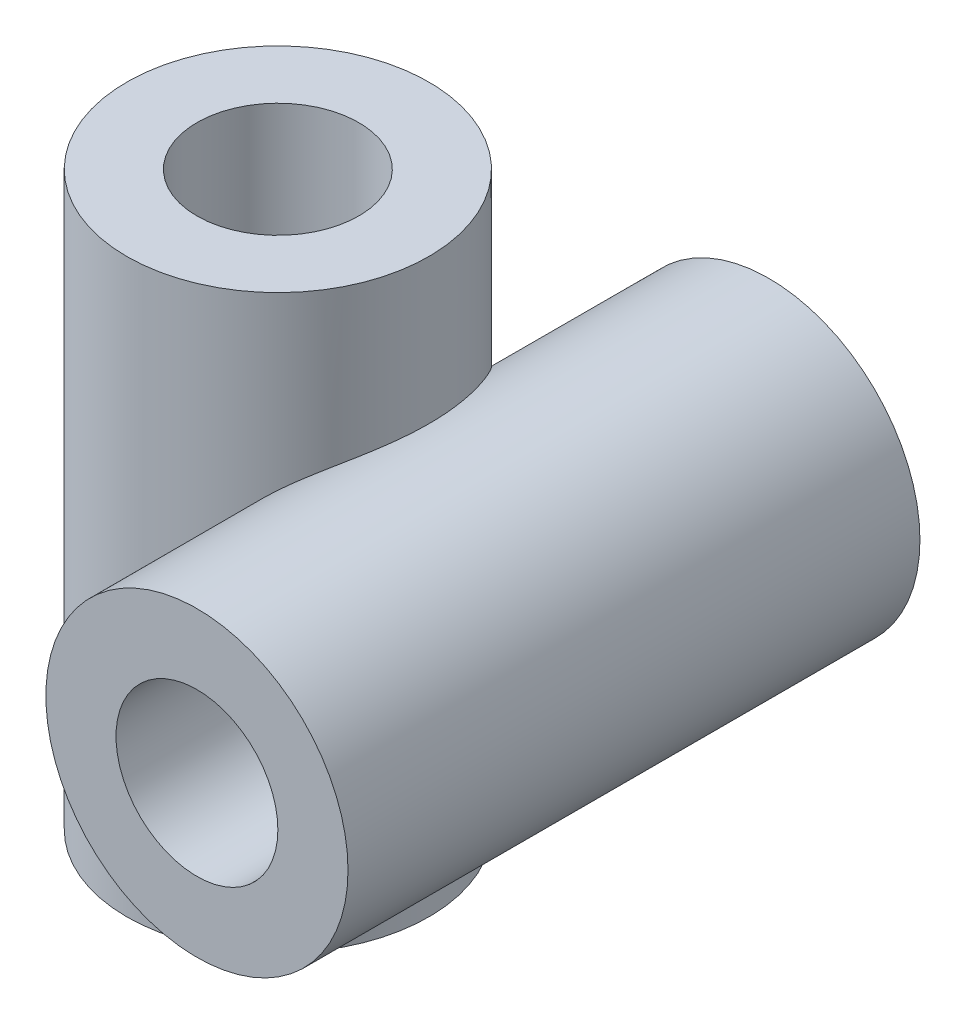
ISO-10303-21;
HEADER;
FILE_DESCRIPTION(('STEP AP214'),'2;1');
FILE_NAME('part.step','',(''),(''),'','','');
FILE_SCHEMA(('AUTOMOTIVE_DESIGN { 1 0 10303 214 1 1 1 1 }'));
ENDSEC;
DATA;
#1=APPLICATION_CONTEXT('core data for automotive mechanical design processes');
#2=APPLICATION_PROTOCOL_DEFINITION('international standard','automotive_design',2000,#1);
#3=PRODUCT_CONTEXT('',#1,'mechanical');
#4=PRODUCT('Part','Part','',(#3));
#5=PRODUCT_RELATED_PRODUCT_CATEGORY('part','',(#4));
#6=PRODUCT_DEFINITION_FORMATION('','',#4);
#7=PRODUCT_DEFINITION_CONTEXT('part definition',#1,'design');
#8=PRODUCT_DEFINITION('design','',#6,#7);
#9=PRODUCT_DEFINITION_SHAPE('','',#8);
#10=(LENGTH_UNIT() NAMED_UNIT(*) SI_UNIT(.MILLI.,.METRE.));
#11=(NAMED_UNIT(*) PLANE_ANGLE_UNIT() SI_UNIT($,.RADIAN.));
#12=(NAMED_UNIT(*) SI_UNIT($,.STERADIAN.) SOLID_ANGLE_UNIT());
#13=UNCERTAINTY_MEASURE_WITH_UNIT(LENGTH_MEASURE(1.E-05),#10,'distance_accuracy_value','');
#14=(GEOMETRIC_REPRESENTATION_CONTEXT(3) GLOBAL_UNCERTAINTY_ASSIGNED_CONTEXT((#13)) GLOBAL_UNIT_ASSIGNED_CONTEXT((#10,
#11,#12)) REPRESENTATION_CONTEXT('',''));
#15=CARTESIAN_POINT('',(0.,0.,0.));
#16=DIRECTION('',(0.,0.,1.));
#17=DIRECTION('',(1.,0.,0.));
#18=AXIS2_PLACEMENT_3D('',#15,#16,#17);
#19=CARTESIAN_POINT('',(0.,0.,106.));
#20=DIRECTION('',(0.,0.,-1.));
#21=DIRECTION('',(-1.,0.,0.));
#22=AXIS2_PLACEMENT_3D('',#19,#20,#21);
#23=CYLINDRICAL_SURFACE('',#22,28.);
#24=CARTESIAN_POINT('',(0.,0.,0.));
#25=DIRECTION('',(0.,0.,1.));
#26=DIRECTION('',(1.,0.,0.));
#27=AXIS2_PLACEMENT_3D('',#24,#25,#26);
#28=CIRCLE('',#27,28.);
#29=CARTESIAN_POINT('',(28.,0.,0.));
#30=VERTEX_POINT('',#29);
#31=EDGE_CURVE('E43',#30,#30,#28,.T.);
#32=ORIENTED_EDGE('',*,*,#31,.T.);
#33=EDGE_LOOP('',(#32));
#34=FACE_BOUND('',#33,.T.);
#35=CARTESIAN_POINT('',(0.,0.,106.));
#36=DIRECTION('',(0.,0.,1.));
#37=DIRECTION('',(1.,0.,0.));
#38=AXIS2_PLACEMENT_3D('',#35,#36,#37);
#39=CIRCLE('',#38,28.);
#40=CARTESIAN_POINT('',(28.,0.,106.));
#41=VERTEX_POINT('',#40);
#42=EDGE_CURVE('E48',#41,#41,#39,.T.);
#43=ORIENTED_EDGE('',*,*,#42,.F.);
#44=EDGE_LOOP('',(#43));
#45=FACE_BOUND('',#44,.T.);
#46=CARTESIAN_POINT('',(-28.,0.,79.1533936612441));
#47=CARTESIAN_POINT('',(-27.9999984381259,0.709976885836484,79.1533951565687));
#48=CARTESIAN_POINT('',(-27.9729742140714,1.41998183568938,79.143108613888));
#49=CARTESIAN_POINT('',(-27.8651177596588,2.83530719546801,79.1014840703157));
#50=CARTESIAN_POINT('',(-27.7842822941506,3.54062732116545,79.0701448037262));
#51=CARTESIAN_POINT('',(-27.5695302381335,4.94202781984829,78.9849696736577));
#52=CARTESIAN_POINT('',(-27.4355958153276,5.63810500751963,78.9311262522472));
#53=CARTESIAN_POINT('',(-27.1159995271492,7.01588430780221,78.7986131405806));
#54=CARTESIAN_POINT('',(-26.930338507867,7.69758665534608,78.7199438563977));
#55=CARTESIAN_POINT('',(-26.5087446696491,9.04351225614709,78.534373351261));
#56=CARTESIAN_POINT('',(-26.2726712965789,9.70768068275535,78.4273929927594));
#57=CARTESIAN_POINT('',(-25.7535046874517,11.0113205595334,78.1814576369852));
#58=CARTESIAN_POINT('',(-25.4704109052659,11.6507917227451,78.0425022683247));
#59=CARTESIAN_POINT('',(-24.861405165573,12.8993262251224,77.7284162876105));
#60=CARTESIAN_POINT('',(-24.5355187352839,13.5084073963288,77.5533072070682));
#61=CARTESIAN_POINT('',(-23.8460975935534,14.6912238323088,77.1624488017474));
#62=CARTESIAN_POINT('',(-23.4825657553982,15.2649617893303,76.9467025775715));
#63=CARTESIAN_POINT('',(-22.7436764670392,16.344145503955,76.4824431934799));
#64=CARTESIAN_POINT('',(-22.3698372914414,16.8515755503644,76.2361282063485));
#65=CARTESIAN_POINT('',(-21.6012246731877,17.8261652888708,75.7002095711564));
#66=CARTESIAN_POINT('',(-21.2064520259499,18.2933265093112,75.4106075671317));
#67=CARTESIAN_POINT('',(-20.404222973058,19.1840229994171,74.7863869713479));
#68=CARTESIAN_POINT('',(-19.9967752350801,19.6075872638468,74.4517986443978));
#69=CARTESIAN_POINT('',(-19.1776381360441,20.4094758106507,73.7367800183871));
#70=CARTESIAN_POINT('',(-18.7659491030331,20.7878035637734,73.3563532407609));
#71=CARTESIAN_POINT('',(-17.9867462707627,21.4643214609533,72.5892613550195));
#72=CARTESIAN_POINT('',(-17.6187999937689,21.7667211277595,72.2067333764708));
#73=CARTESIAN_POINT('',(-16.8931257119261,22.3346052027225,71.406292178076));
#74=CARTESIAN_POINT('',(-16.5353969830291,22.6000922318087,70.9883814739235));
#75=CARTESIAN_POINT('',(-15.8360011738096,23.095559436879,70.1192402233057));
#76=CARTESIAN_POINT('',(-15.4943378678454,23.3255312977475,69.6680019103407));
#77=CARTESIAN_POINT('',(-14.8324261033276,23.7519302638262,68.735015088988));
#78=CARTESIAN_POINT('',(-14.5121784747898,23.9483560693368,68.2532653994664));
#79=CARTESIAN_POINT('',(-13.8948748078847,24.3117655120013,67.2579434933272));
#80=CARTESIAN_POINT('',(-13.5980518122444,24.478470106555,66.7441251945481));
#81=CARTESIAN_POINT('',(-13.0346403283078,24.7830738132666,65.6920037715129));
#82=CARTESIAN_POINT('',(-12.76805172272,24.9209730371738,65.1537007422543));
#83=CARTESIAN_POINT('',(-12.268096840831,25.1708552897019,64.0559060360338));
#84=CARTESIAN_POINT('',(-12.0347396656878,25.2828312238934,63.4964086074304));
#85=CARTESIAN_POINT('',(-11.6037109566939,25.4835321693592,62.3597780049199));
#86=CARTESIAN_POINT('',(-11.4060414365424,25.5722558687385,61.7826438379954));
#87=CARTESIAN_POINT('',(-11.0305141536826,25.7366260584061,60.5562992471674));
#88=CARTESIAN_POINT('',(-10.856547996343,25.8101120241989,59.9056046774216));
#89=CARTESIAN_POINT('',(-10.5556605435343,25.9346203207608,58.5913158839528));
#90=CARTESIAN_POINT('',(-10.4287418836904,25.9856413930649,57.9277209397351));
#91=CARTESIAN_POINT('',(-10.2230816984669,26.0672373257567,56.5916315771135));
#92=CARTESIAN_POINT('',(-10.1443570678987,26.0978050163927,55.9191341221664));
#93=CARTESIAN_POINT('',(-10.0358328302353,26.1397287660719,54.5696073712688));
#94=CARTESIAN_POINT('',(-10.0060346338571,26.1510842711621,53.8925779452111));
#95=CARTESIAN_POINT('',(-9.99524600557182,26.1552134988389,52.4892588680764));
#96=CARTESIAN_POINT('',(-10.0179258847931,26.1465898271697,51.7629337264117));
#97=CARTESIAN_POINT('',(-10.1196018400561,26.1074050165719,50.3147976300103));
#98=CARTESIAN_POINT('',(-10.1986009618216,26.0768426912085,49.592986921542));
#99=CARTESIAN_POINT('',(-10.4121705774214,25.9923045704661,48.1587786889989));
#100=CARTESIAN_POINT('',(-10.5467578204893,25.9383217180105,47.4463840689053));
#101=CARTESIAN_POINT('',(-10.870088334781,25.8044913168915,46.0364550563472));
#102=CARTESIAN_POINT('',(-11.0588307801031,25.7246441626729,45.3389204374324));
#103=CARTESIAN_POINT('',(-11.4890794544685,25.5353962646344,43.9615554347488));
#104=CARTESIAN_POINT('',(-11.7307753266249,25.4258889565018,43.2817987735599));
#105=CARTESIAN_POINT('',(-12.2633789074592,25.1733260828958,41.9482227437783));
#106=CARTESIAN_POINT('',(-12.5542874524101,25.0302699473098,41.2944038161796));
#107=CARTESIAN_POINT('',(-13.1807464966522,24.7061154040043,40.0188955486616));
#108=CARTESIAN_POINT('',(-13.5162646186848,24.5250445323886,39.3971833560734));
#109=CARTESIAN_POINT('',(-14.2263503840095,24.1200714915482,38.1911149479392));
#110=CARTESIAN_POINT('',(-14.6009139018382,23.8961738452374,37.6067547963499));
#111=CARTESIAN_POINT('',(-15.3533418950786,23.4191905727623,36.5217547384183));
#112=CARTESIAN_POINT('',(-15.7289826071127,23.1694146657741,36.018116974594));
#113=CARTESIAN_POINT('',(-16.5005041850347,22.6264386530195,35.0513494832961));
#114=CARTESIAN_POINT('',(-16.8963839382018,22.3332409328603,34.5882175326429));
#115=CARTESIAN_POINT('',(-17.7000722646121,21.7018044114343,33.7057277665815));
#116=CARTESIAN_POINT('',(-18.1078724327715,21.3635967760817,33.286340016896));
#117=CARTESIAN_POINT('',(-18.9269531056332,20.6414231320502,32.4928298168692));
#118=CARTESIAN_POINT('',(-19.3382333596299,20.2574603939361,32.1187041350529));
#119=CARTESIAN_POINT('',(-20.1158073335202,19.483975929758,31.450227859341));
#120=CARTESIAN_POINT('',(-20.482602941555,19.0985878612223,31.1516608938746));
#121=CARTESIAN_POINT('',(-21.205433893717,18.2926889936425,30.5912584996875));
#122=CARTESIAN_POINT('',(-21.5614700162967,17.8721807438804,30.3294204086047));
#123=CARTESIAN_POINT('',(-22.2570193148065,16.9981503811355,29.8409999388902));
#124=CARTESIAN_POINT('',(-22.5965283814272,16.5446201267706,29.6144262979983));
#125=CARTESIAN_POINT('',(-23.2537517569303,15.6073908715784,29.1945322607718));
#126=CARTESIAN_POINT('',(-23.5714651818277,15.1236906486383,29.0012132126941));
#127=CARTESIAN_POINT('',(-24.1842733360341,14.1233517127056,28.6432109737138));
#128=CARTESIAN_POINT('',(-24.4790549676851,13.606390279199,28.4788947620416));
#129=CARTESIAN_POINT('',(-25.0379816586756,12.5482093878485,28.1789057433235));
#130=CARTESIAN_POINT('',(-25.3021267825501,12.0069899811069,28.0432328759406));
#131=CARTESIAN_POINT('',(-25.796841411303,10.9036069024846,27.7976342067729));
#132=CARTESIAN_POINT('',(-26.0274017404512,10.3414375593412,27.6877154363142));
#133=CARTESIAN_POINT('',(-26.4525292918458,9.19972000244511,27.4909666374779));
#134=CARTESIAN_POINT('',(-26.6470944932686,8.62017081508169,27.4041379052919));
#135=CARTESIAN_POINT('',(-27.0159263150997,7.38869839317002,27.2435520933483));
#136=CARTESIAN_POINT('',(-27.1862497079339,6.73530964000983,27.1719538675638));
#137=CARTESIAN_POINT('',(-27.4795241963479,5.41595216513477,27.0511130743347));
#138=CARTESIAN_POINT('',(-27.602472611288,4.74998273379767,27.0018717718939));
#139=CARTESIAN_POINT('',(-27.7999023836183,3.40948079075566,26.9237790308362));
#140=CARTESIAN_POINT('',(-27.8743666610372,2.73494534664035,26.8949347773754));
#141=CARTESIAN_POINT('',(-27.9741177542991,1.3817023809471,26.8564631395068));
#142=CARTESIAN_POINT('',(-27.9994031924385,0.702994743022993,26.8468362934581));
#143=CARTESIAN_POINT('',(-28.0006172251421,-0.702444851428929,26.8463684529381));
#144=CARTESIAN_POINT('',(-27.9729341781602,-1.42918348305218,26.8569021102174));
#145=CARTESIAN_POINT('',(-27.86120268258,-2.87769021143441,26.9000317101688));
#146=CARTESIAN_POINT('',(-27.7771512150413,-3.59945803987881,26.9326288345014));
#147=CARTESIAN_POINT('',(-27.5534821826111,-5.03309707628124,27.0214560111069));
#148=CARTESIAN_POINT('',(-27.4138483643097,-5.74496532632873,27.0776929764199));
#149=CARTESIAN_POINT('',(-27.0804977191668,-7.15333862947437,27.2163417040296));
#150=CARTESIAN_POINT('',(-26.8867817907477,-7.8498439375773,27.2987530315159));
#151=CARTESIAN_POINT('',(-26.447073366051,-9.22352409660855,27.4933776701365));
#152=CARTESIAN_POINT('',(-26.2009743118044,-9.90065630463831,27.6056518463836));
#153=CARTESIAN_POINT('',(-25.6599765712134,-11.2285124794813,27.8640967418021));
#154=CARTESIAN_POINT('',(-25.3650771202214,-11.8792360323015,28.0102679921171));
#155=CARTESIAN_POINT('',(-24.7311670990912,-13.1480753592906,28.3410116150776));
#156=CARTESIAN_POINT('',(-24.3921897330951,-13.7662151912565,28.5255551437353));
#157=CARTESIAN_POINT('',(-23.675828041825,-14.9647031238778,28.9378157071812));
#158=CARTESIAN_POINT('',(-23.2984478499594,-15.5450552807281,29.1655280978504));
#159=CARTESIAN_POINT('',(-22.5419830103742,-16.6210364876805,29.649711508497));
#160=CARTESIAN_POINT('',(-22.1651158857606,-17.1197564281276,29.9027804933281));
#161=CARTESIAN_POINT('',(-21.3919444052643,-18.0765856945976,30.4523330118952));
#162=CARTESIAN_POINT('',(-20.9956411418849,-18.5346972991561,30.7488141072974));
#163=CARTESIAN_POINT('',(-20.1919117618148,-19.4071725263124,31.386695385958));
#164=CARTESIAN_POINT('',(-19.7844931646755,-19.8215648446528,31.7280657707567));
#165=CARTESIAN_POINT('',(-18.9669617898868,-20.6052176020023,32.4563164276062));
#166=CARTESIAN_POINT('',(-18.5568491981139,-20.9744811209861,32.8431935903451));
#167=CARTESIAN_POINT('',(-17.7817117745733,-21.6343390541934,33.6223495565918));
#168=CARTESIAN_POINT('',(-17.4161259015717,-21.929079688092,34.0105733391136));
#169=CARTESIAN_POINT('',(-16.6962490036892,-22.4820211578104,34.8218754375706));
#170=CARTESIAN_POINT('',(-16.3419571686232,-22.7402246192381,35.2449512455342));
#171=CARTESIAN_POINT('',(-15.6503525845425,-23.2216303989772,36.1238027594317));
#172=CARTESIAN_POINT('',(-15.3130441393395,-23.4448238753149,36.5795866837635));
#173=CARTESIAN_POINT('',(-14.6605929868522,-23.8582529534624,37.5209788288913));
#174=CARTESIAN_POINT('',(-14.3454512074691,-24.0484871760782,38.0065882965988));
#175=CARTESIAN_POINT('',(-13.737196875416,-24.4011248483334,39.0119096579434));
#176=CARTESIAN_POINT('',(-13.4444814171042,-24.5630725646571,39.5320211758612));
#177=CARTESIAN_POINT('',(-12.8900883811088,-24.8584858239743,40.5962753071398));
#178=CARTESIAN_POINT('',(-12.6284107982749,-24.9919513716939,41.1404179165131));
#179=CARTESIAN_POINT('',(-12.1389837782726,-25.2333028926104,42.2494042521677));
#180=CARTESIAN_POINT('',(-11.9112436719903,-25.3411818357441,42.8142536186425));
#181=CARTESIAN_POINT('',(-11.492064624323,-25.5340101618256,43.9610741647369));
#182=CARTESIAN_POINT('',(-11.3006277085367,-25.6189582654199,44.543046297659));
#183=CARTESIAN_POINT('',(-10.9385588964511,-25.7757783418845,45.7796231995516));
#184=CARTESIAN_POINT('',(-10.7719193309279,-25.8454945131698,46.435673391265));
#185=CARTESIAN_POINT('',(-10.486336099191,-25.9626764261116,47.7600307187985));
#186=CARTESIAN_POINT('',(-10.3673951574701,-26.0101408968017,48.4283385524823));
#187=CARTESIAN_POINT('',(-10.178266495883,-26.0847320503578,49.7731770679717));
#188=CARTESIAN_POINT('',(-10.1080960100257,-26.1118515441907,50.4497105706417));
#189=CARTESIAN_POINT('',(-10.0171808435069,-26.1468628637206,51.8065862749177));
#190=CARTESIAN_POINT('',(-9.99643750668897,-26.1547541666347,52.4869285795749));
#191=CARTESIAN_POINT('',(-10.0048410040642,-26.1515444077961,53.8943801637785));
#192=CARTESIAN_POINT('',(-10.0375391411801,-26.1390914492149,54.621468189172));
#193=CARTESIAN_POINT('',(-10.1593417088307,-26.091991288264,56.0702152119083));
#194=CARTESIAN_POINT('',(-10.2484491303045,-26.0573429090451,56.791873919324));
#195=CARTESIAN_POINT('',(-10.4822154525706,-25.9641867296754,58.2248085396395));
#196=CARTESIAN_POINT('',(-10.626890063598,-25.9056721816715,58.9360814571303));
#197=CARTESIAN_POINT('',(-10.9702387489759,-25.7621517231294,60.3427591009378));
#198=CARTESIAN_POINT('',(-11.1689118510374,-25.6771462895783,61.0381641127252));
#199=CARTESIAN_POINT('',(-11.6180183572904,-25.477089230705,62.4080160822885));
#200=CARTESIAN_POINT('',(-11.8684755699675,-25.3620237784241,63.0824532351325));
#201=CARTESIAN_POINT('',(-12.4177648438296,-25.0976485013044,64.4044513688151));
#202=CARTESIAN_POINT('',(-12.7165975974723,-24.9483381862648,65.0520119647704));
#203=CARTESIAN_POINT('',(-13.3578306286778,-24.6109615755607,66.3140536238503));
#204=CARTESIAN_POINT('',(-13.7001970001655,-24.4229253715985,66.9285599068121));
#205=CARTESIAN_POINT('',(-14.4226813743613,-24.0033455163941,68.1193526670986));
#206=CARTESIAN_POINT('',(-14.8027952425807,-23.7718066275344,68.6956433186803));
#207=CARTESIAN_POINT('',(-15.5631286936547,-23.2804192856283,69.7625414621265));
#208=CARTESIAN_POINT('',(-15.941140942027,-23.0240638551025,70.2563320925975));
#209=CARTESIAN_POINT('',(-16.7157999653771,-22.4679597386105,71.2032114537074));
#210=CARTESIAN_POINT('',(-17.1124456711737,-22.1682135403421,71.6563025153394));
#211=CARTESIAN_POINT('',(-17.9160562978864,-21.5239373570138,72.518772456896));
#212=CARTESIAN_POINT('',(-18.323014482139,-21.1794360307723,72.9281790071026));
#213=CARTESIAN_POINT('',(-19.1388473927572,-20.4451829463782,73.7020057074176));
#214=CARTESIAN_POINT('',(-19.5477219923893,-20.0554341410529,74.0664287899252));
#215=CARTESIAN_POINT('',(-20.3203271558074,-19.2706591431489,74.7177340907624));
#216=CARTESIAN_POINT('',(-20.6846748803314,-18.8796063142696,75.0086888812245));
#217=CARTESIAN_POINT('',(-21.4015479470594,-18.0629145544727,75.5542522011156));
#218=CARTESIAN_POINT('',(-21.7540741246747,-17.637278074838,75.808863303058));
#219=CARTESIAN_POINT('',(-22.4417062473455,-16.7536073069708,76.2833444323065));
#220=CARTESIAN_POINT('',(-22.7768072731573,-16.2955639552752,76.5032046845476));
#221=CARTESIAN_POINT('',(-23.4244768484679,-15.3499941140137,76.9102589311853));
#222=CARTESIAN_POINT('',(-23.7370444609365,-14.8624663999175,77.0974515675904));
#223=CARTESIAN_POINT('',(-24.3407320889631,-13.8521206807165,77.4447926923447));
#224=CARTESIAN_POINT('',(-24.631368618893,-13.3288275032332,77.6043977078006));
#225=CARTESIAN_POINT('',(-25.1812018534866,-12.2584314928989,77.8952844604044));
#226=CARTESIAN_POINT('',(-25.4403983064527,-11.711328469483,78.0265659708115));
#227=CARTESIAN_POINT('',(-25.9244843759832,-10.5967155290843,78.2637014252133));
#228=CARTESIAN_POINT('',(-26.1493676523434,-10.0292018646139,78.3695506720426));
#229=CARTESIAN_POINT('',(-26.5625231640858,-8.87731993503589,78.558476686743));
#230=CARTESIAN_POINT('',(-26.7507942657945,-8.29295114866302,78.6415527494892));
#231=CARTESIAN_POINT('',(-27.0978713993792,-7.07982469997787,78.7911069672205));
#232=CARTESIAN_POINT('',(-27.2546221496646,-6.45034367334495,78.8564901836644));
#233=CARTESIAN_POINT('',(-27.5242771244691,-5.18031384533782,78.9669107466703));
#234=CARTESIAN_POINT('',(-27.6371804178829,-4.53976480923493,79.0119476611796));
#235=CARTESIAN_POINT('',(-27.8182174816707,-3.25118146497631,79.083343148474));
#236=CARTESIAN_POINT('',(-27.8863400356656,-2.60314532282901,79.1096970417908));
#237=CARTESIAN_POINT('',(-27.9772330098099,-1.30341410942099,79.1447220010326));
#238=CARTESIAN_POINT('',(-28.0000014337127,-0.651718878372677,79.15339228862));
#239=CARTESIAN_POINT('',(-28.,0.,79.1533936612441));
#240=B_SPLINE_CURVE_WITH_KNOTS('',3,(#46,#47,#48,#49,#50,#51,#52,#53,#54,#55,#56,#57,#58,#59,
#60,#61,#62,#63,#64,#65,#66,#67,#68,#69,#70,#71,#72,#73,#74,#75,#76,#77,#78,#79,#80,#81,#82,#83,
#84,#85,#86,#87,#88,#89,#90,#91,#92,#93,#94,#95,#96,#97,#98,#99,#100,#101,#102,#103,#104,#105,
#106,#107,#108,#109,#110,#111,#112,#113,#114,#115,#116,#117,#118,#119,#120,#121,#122,#123,#124,
#125,#126,#127,#128,#129,#130,#131,#132,#133,#134,#135,#136,#137,#138,#139,#140,#141,#142,#143,
#144,#145,#146,#147,#148,#149,#150,#151,#152,#153,#154,#155,#156,#157,#158,#159,#160,#161,#162,
#163,#164,#165,#166,#167,#168,#169,#170,#171,#172,#173,#174,#175,#176,#177,#178,#179,#180,#181,
#182,#183,#184,#185,#186,#187,#188,#189,#190,#191,#192,#193,#194,#195,#196,#197,#198,#199,#200,
#201,#202,#203,#204,#205,#206,#207,#208,#209,#210,#211,#212,#213,#214,#215,#216,#217,#218,#219,
#220,#221,#222,#223,#224,#225,#226,#227,#228,#229,#230,#231,#232,#233,#234,#235,#236,#237,#238,
#239),.UNSPECIFIED.,.T.,.F.,(4,2,2,2,2,2,2,2,2,2,2,2,2,2,2,2,2,2,2,2,2,2,2,2,2,2,2,2,2,2,2,2,2,
2,2,2,2,2,2,2,2,2,2,2,2,2,2,2,2,2,2,2,2,2,2,2,2,2,2,2,2,2,2,2,2,2,2,2,2,2,2,2,2,2,2,2,2,2,2,2,2,
2,2,2,2,2,2,2,2,2,2,2,2,2,2,2,4),(0.,2.12938980774149,4.25890764668024,6.38914125118865,
8.51934001357756,10.6555573660829,12.7917995318887,14.926773099723,17.0615838356185,
19.0888514434232,21.1160420753919,23.1418756641779,25.1675537220274,26.9979446133219,
28.8282054738734,30.6588942032504,32.4896538442717,34.3367877293808,36.1839144484642,
38.0315460749171,39.8792819226267,41.9097204356408,43.9402726776875,45.9715363394355,
48.0028585684532,50.1805001987398,52.3582596040099,54.5366756683023,56.7150585121077,
58.9013742175732,61.0877270789228,63.2725016787141,65.4570456728321,67.4826180677993,
69.5080792184763,71.5321451195887,73.5560664275944,75.384129805355,77.2120606039232,
79.0404436041712,80.868900715972,82.7190524533884,84.5692002934356,86.4198526696625,
88.2706089129443,90.3054299226038,92.3403660525591,94.3760186616453,96.4117282969912,
98.5911981356227,100.770784710096,102.951009108784,105.131197291323,107.315863545232,
109.50056403366,111.683628207168,113.866457659124,115.886817596194,117.90706409893,
119.925976226209,121.944750488643,123.77045836047,125.596034967892,127.422071895447,
129.248185215857,131.101443337605,132.954701151833,134.808467570707,136.662337393239,
138.701514490683,140.740808047086,142.780821862475,144.820891141873,147.002116616583,
149.18345775415,151.365416065958,153.547335092345,155.730259526876,157.913215211005,
160.094481000475,162.275508138563,164.290635505195,166.305647385415,168.319375260567,
170.332971794665,172.156434102418,173.979767276055,175.803612425732,177.627533374537,
179.484070305464,181.340622098142,183.197516520129,185.054468430558,187.008511816161,
188.962596693812,190.917170831219,192.871830996647),.UNSPECIFIED.);
#241=CARTESIAN_POINT('',(-28.,0.,79.1533936612441));
#242=VERTEX_POINT('',#241);
#243=EDGE_CURVE('E10',#242,#242,#240,.T.);
#244=ORIENTED_EDGE('',*,*,#243,.F.);
#245=EDGE_LOOP('',(#244));
#246=FACE_BOUND('',#245,.T.);
#247=ADVANCED_FACE('F39',(#34,#45,#246),#23,.T.);
#248=CARTESIAN_POINT('',(0.,0.,106.));
#249=DIRECTION('',(0.,0.,-1.));
#250=DIRECTION('',(-1.,0.,0.));
#251=AXIS2_PLACEMENT_3D('',#248,#249,#250);
#252=CYLINDRICAL_SURFACE('',#251,15.);
#253=CARTESIAN_POINT('',(0.,0.,0.));
#254=DIRECTION('',(0.,0.,1.));
#255=DIRECTION('',(1.,0.,0.));
#256=AXIS2_PLACEMENT_3D('',#253,#254,#255);
#257=CIRCLE('',#256,15.);
#258=CARTESIAN_POINT('',(15.,0.,0.));
#259=VERTEX_POINT('',#258);
#260=EDGE_CURVE('E102',#259,#259,#257,.T.);
#261=ORIENTED_EDGE('',*,*,#260,.F.);
#262=EDGE_LOOP('',(#261));
#263=FACE_BOUND('',#262,.T.);
#264=CARTESIAN_POINT('',(0.,0.,106.));
#265=DIRECTION('',(0.,0.,1.));
#266=DIRECTION('',(1.,0.,0.));
#267=AXIS2_PLACEMENT_3D('',#264,#265,#266);
#268=CIRCLE('',#267,15.);
#269=CARTESIAN_POINT('',(15.,0.,106.));
#270=VERTEX_POINT('',#269);
#271=EDGE_CURVE('E62',#270,#270,#268,.T.);
#272=ORIENTED_EDGE('',*,*,#271,.T.);
#273=EDGE_LOOP('',(#272));
#274=FACE_BOUND('',#273,.T.);
#275=ADVANCED_FACE('F73',(#263,#274),#252,.F.);
#276=CARTESIAN_POINT('',(0.,0.,106.));
#277=DIRECTION('',(0.,0.,1.));
#278=DIRECTION('',(1.,0.,0.));
#279=AXIS2_PLACEMENT_3D('',#276,#277,#278);
#280=PLANE('',#279);
#281=ORIENTED_EDGE('',*,*,#42,.T.);
#282=EDGE_LOOP('',(#281));
#283=FACE_BOUND('',#282,.T.);
#284=ORIENTED_EDGE('',*,*,#271,.F.);
#285=EDGE_LOOP('',(#284));
#286=FACE_BOUND('',#285,.T.);
#287=ADVANCED_FACE('F76',(#283,#286),#280,.T.);
#288=CARTESIAN_POINT('',(0.,0.,0.));
#289=DIRECTION('',(0.,0.,1.));
#290=DIRECTION('',(1.,0.,0.));
#291=AXIS2_PLACEMENT_3D('',#288,#289,#290);
#292=PLANE('',#291);
#293=ORIENTED_EDGE('',*,*,#31,.F.);
#294=EDGE_LOOP('',(#293));
#295=FACE_BOUND('',#294,.T.);
#296=ORIENTED_EDGE('',*,*,#260,.T.);
#297=EDGE_LOOP('',(#296));
#298=FACE_BOUND('',#297,.T.);
#299=ADVANCED_FACE('F79',(#295,#298),#292,.F.);
#300=CARTESIAN_POINT('',(-38.,53.,53.));
#301=DIRECTION('',(0.,-1.,0.));
#302=DIRECTION('',(0.,0.,-1.));
#303=AXIS2_PLACEMENT_3D('',#300,#301,#302);
#304=CYLINDRICAL_SURFACE('',#303,15.);
#305=CARTESIAN_POINT('',(-38.,-53.,53.));
#306=DIRECTION('',(0.,1.,0.));
#307=DIRECTION('',(0.,0.,1.));
#308=AXIS2_PLACEMENT_3D('',#305,#306,#307);
#309=CIRCLE('',#308,15.);
#310=CARTESIAN_POINT('',(-38.,-53.,68.));
#311=VERTEX_POINT('',#310);
#312=EDGE_CURVE('E60',#311,#311,#309,.T.);
#313=ORIENTED_EDGE('',*,*,#312,.F.);
#314=EDGE_LOOP('',(#313));
#315=FACE_BOUND('',#314,.T.);
#316=CARTESIAN_POINT('',(-38.,53.,53.));
#317=DIRECTION('',(0.,1.,0.));
#318=DIRECTION('',(0.,0.,1.));
#319=AXIS2_PLACEMENT_3D('',#316,#317,#318);
#320=CIRCLE('',#319,15.);
#321=CARTESIAN_POINT('',(-38.,53.,68.));
#322=VERTEX_POINT('',#321);
#323=EDGE_CURVE('E106',#322,#322,#320,.T.);
#324=ORIENTED_EDGE('',*,*,#323,.T.);
#325=EDGE_LOOP('',(#324));
#326=FACE_BOUND('',#325,.T.);
#327=ADVANCED_FACE('F70',(#315,#326),#304,.F.);
#328=CARTESIAN_POINT('',(-38.,53.,53.));
#329=DIRECTION('',(0.,-1.,0.));
#330=DIRECTION('',(0.,0.,-1.));
#331=AXIS2_PLACEMENT_3D('',#328,#329,#330);
#332=CYLINDRICAL_SURFACE('',#331,28.);
#333=CARTESIAN_POINT('',(-38.,53.,53.));
#334=DIRECTION('',(0.,1.,0.));
#335=DIRECTION('',(0.,0.,1.));
#336=AXIS2_PLACEMENT_3D('',#333,#334,#335);
#337=CIRCLE('',#336,28.);
#338=CARTESIAN_POINT('',(-38.,53.,81.));
#339=VERTEX_POINT('',#338);
#340=EDGE_CURVE('E110',#339,#339,#337,.T.);
#341=ORIENTED_EDGE('',*,*,#340,.F.);
#342=EDGE_LOOP('',(#341));
#343=FACE_BOUND('',#342,.T.);
#344=CARTESIAN_POINT('',(-38.,-53.,53.));
#345=DIRECTION('',(0.,1.,0.));
#346=DIRECTION('',(0.,0.,1.));
#347=AXIS2_PLACEMENT_3D('',#344,#345,#346);
#348=CIRCLE('',#347,28.);
#349=CARTESIAN_POINT('',(-38.,-53.,81.));
#350=VERTEX_POINT('',#349);
#351=EDGE_CURVE('E117',#350,#350,#348,.T.);
#352=ORIENTED_EDGE('',*,*,#351,.T.);
#353=EDGE_LOOP('',(#352));
#354=FACE_BOUND('',#353,.T.);
#355=ORIENTED_EDGE('',*,*,#243,.T.);
#356=EDGE_LOOP('',(#355));
#357=FACE_BOUND('',#356,.T.);
#358=ADVANCED_FACE('F64',(#343,#354,#357),#332,.T.);
#359=CARTESIAN_POINT('',(0.,53.,0.));
#360=DIRECTION('',(0.,1.,0.));
#361=DIRECTION('',(0.,0.,1.));
#362=AXIS2_PLACEMENT_3D('',#359,#360,#361);
#363=PLANE('',#362);
#364=ORIENTED_EDGE('',*,*,#340,.T.);
#365=EDGE_LOOP('',(#364));
#366=FACE_BOUND('',#365,.T.);
#367=ORIENTED_EDGE('',*,*,#323,.F.);
#368=EDGE_LOOP('',(#367));
#369=FACE_BOUND('',#368,.T.);
#370=ADVANCED_FACE('F69',(#366,#369),#363,.T.);
#371=CARTESIAN_POINT('',(0.,-53.,0.));
#372=DIRECTION('',(0.,1.,0.));
#373=DIRECTION('',(0.,0.,1.));
#374=AXIS2_PLACEMENT_3D('',#371,#372,#373);
#375=PLANE('',#374);
#376=ORIENTED_EDGE('',*,*,#351,.F.);
#377=EDGE_LOOP('',(#376));
#378=FACE_BOUND('',#377,.T.);
#379=ORIENTED_EDGE('',*,*,#312,.T.);
#380=EDGE_LOOP('',(#379));
#381=FACE_BOUND('',#380,.T.);
#382=ADVANCED_FACE('F126',(#378,#381),#375,.F.);
#383=CLOSED_SHELL('',(#247,#275,#287,#299,#327,#358,#370,#382));
#384=MANIFOLD_SOLID_BREP('B2',#383);
#385=ADVANCED_BREP_SHAPE_REPRESENTATION('',(#18,#384),#14);
#386=SHAPE_DEFINITION_REPRESENTATION(#9,#385);
ENDSEC;
END-ISO-10303-21;
